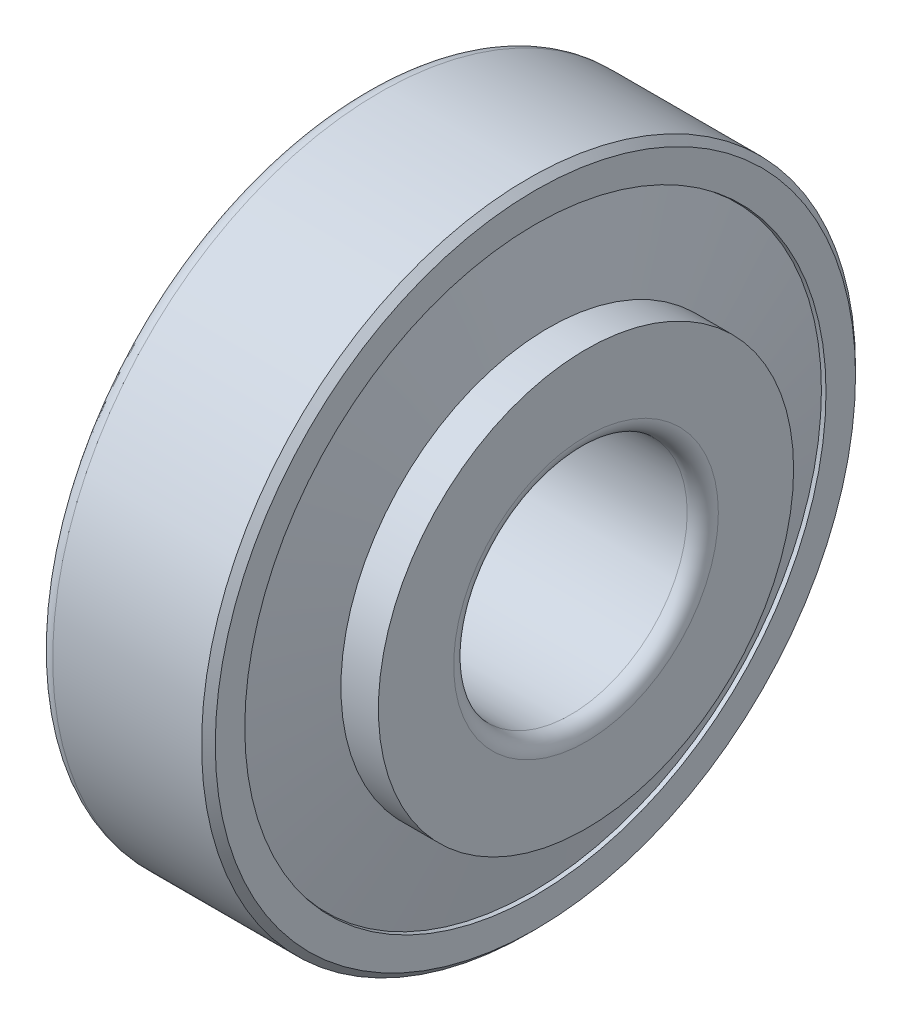
ISO-10303-21;
HEADER;
FILE_DESCRIPTION(('STEP AP214'),'2;1');
FILE_NAME('part.step','',(''),(''),'','','');
FILE_SCHEMA(('AUTOMOTIVE_DESIGN { 1 0 10303 214 1 1 1 1 }'));
ENDSEC;
DATA;
#1=APPLICATION_CONTEXT('core data for automotive mechanical design processes');
#2=APPLICATION_PROTOCOL_DEFINITION('international standard','automotive_design',2000,#1);
#3=PRODUCT_CONTEXT('',#1,'mechanical');
#4=PRODUCT('Part','Part','',(#3));
#5=PRODUCT_RELATED_PRODUCT_CATEGORY('part','',(#4));
#6=PRODUCT_DEFINITION_FORMATION('','',#4);
#7=PRODUCT_DEFINITION_CONTEXT('part definition',#1,'design');
#8=PRODUCT_DEFINITION('design','',#6,#7);
#9=PRODUCT_DEFINITION_SHAPE('','',#8);
#10=(LENGTH_UNIT() NAMED_UNIT(*) SI_UNIT(.MILLI.,.METRE.));
#11=(NAMED_UNIT(*) PLANE_ANGLE_UNIT() SI_UNIT($,.RADIAN.));
#12=(NAMED_UNIT(*) SI_UNIT($,.STERADIAN.) SOLID_ANGLE_UNIT());
#13=UNCERTAINTY_MEASURE_WITH_UNIT(LENGTH_MEASURE(1.E-05),#10,'distance_accuracy_value','');
#14=(GEOMETRIC_REPRESENTATION_CONTEXT(3) GLOBAL_UNCERTAINTY_ASSIGNED_CONTEXT((#13)) GLOBAL_UNIT_ASSIGNED_CONTEXT((#10,
#11,#12)) REPRESENTATION_CONTEXT('',''));
#15=CARTESIAN_POINT('',(0.,0.,0.));
#16=DIRECTION('',(0.,0.,1.));
#17=DIRECTION('',(1.,0.,0.));
#18=AXIS2_PLACEMENT_3D('',#15,#16,#17);
#19=CARTESIAN_POINT('',(-14.25,0.,0.));
#20=DIRECTION('',(1.,0.,0.));
#21=DIRECTION('',(0.,0.,-1.));
#22=AXIS2_PLACEMENT_3D('',#19,#20,#21);
#23=CONICAL_SURFACE('',#22,16.636,0.182386906833399);
#24=CARTESIAN_POINT('',(-13.2349987778327,0.,0.));
#25=DIRECTION('',(-1.,0.,0.));
#26=DIRECTION('',(0.,0.,1.));
#27=AXIS2_PLACEMENT_3D('',#24,#25,#26);
#28=CIRCLE('',#27,16.8232033231802);
#29=CARTESIAN_POINT('',(-13.2349987778327,0.,16.8232033231802));
#30=VERTEX_POINT('',#29);
#31=EDGE_CURVE('E43',#30,#30,#28,.T.);
#32=ORIENTED_EDGE('',*,*,#31,.F.);
#33=EDGE_LOOP('',(#32));
#34=FACE_BOUND('',#33,.T.);
#35=CARTESIAN_POINT('',(-14.25,0.,0.));
#36=DIRECTION('',(1.,0.,0.));
#37=DIRECTION('',(0.,0.,-1.));
#38=AXIS2_PLACEMENT_3D('',#35,#36,#37);
#39=CIRCLE('',#38,16.636);
#40=CARTESIAN_POINT('',(-14.25,0.,-16.636));
#41=VERTEX_POINT('',#40);
#42=EDGE_CURVE('E55',#41,#41,#39,.T.);
#43=ORIENTED_EDGE('',*,*,#42,.F.);
#44=EDGE_LOOP('',(#43));
#45=FACE_BOUND('',#44,.T.);
#46=ADVANCED_FACE('F32',(#34,#45),#23,.F.);
#47=CARTESIAN_POINT('',(-3.24999999999999,20.56,0.));
#48=DIRECTION('',(1.,0.,0.));
#49=DIRECTION('',(0.,0.,-1.));
#50=AXIS2_PLACEMENT_3D('',#47,#48,#49);
#51=PLANE('',#50);
#52=CARTESIAN_POINT('',(-3.25,0.,0.));
#53=DIRECTION('',(1.,0.,0.));
#54=DIRECTION('',(0.,0.,-1.));
#55=AXIS2_PLACEMENT_3D('',#52,#53,#54);
#56=CIRCLE('',#55,20.56);
#57=CARTESIAN_POINT('',(-3.25,0.,-20.56));
#58=VERTEX_POINT('',#57);
#59=EDGE_CURVE('E67',#58,#58,#56,.T.);
#60=ORIENTED_EDGE('',*,*,#59,.T.);
#61=EDGE_LOOP('',(#60));
#62=FACE_BOUND('',#61,.T.);
#63=CARTESIAN_POINT('',(-3.25,0.,0.));
#64=DIRECTION('',(1.,0.,0.));
#65=DIRECTION('',(0.,0.,-1.));
#66=AXIS2_PLACEMENT_3D('',#63,#64,#65);
#67=CIRCLE('',#66,18.6648020447751);
#68=CARTESIAN_POINT('',(-3.25,0.,-18.6648020447751));
#69=VERTEX_POINT('',#68);
#70=EDGE_CURVE('E52',#69,#69,#67,.T.);
#71=ORIENTED_EDGE('',*,*,#70,.F.);
#72=EDGE_LOOP('',(#71));
#73=FACE_BOUND('',#72,.T.);
#74=ADVANCED_FACE('F34',(#62,#73),#51,.T.);
#75=CARTESIAN_POINT('',(-3.49920449774943,0.,0.));
#76=DIRECTION('',(-1.,0.,0.));
#77=DIRECTION('',(0.,0.,1.));
#78=AXIS2_PLACEMENT_3D('',#75,#76,#77);
#79=CIRCLE('',#78,18.6188396270841);
#80=CARTESIAN_POINT('',(-3.49920449774943,0.,18.6188396270841));
#81=VERTEX_POINT('',#80);
#82=EDGE_CURVE('E47',#81,#81,#79,.F.);
#83=ORIENTED_EDGE('',*,*,#82,.F.);
#84=EDGE_LOOP('',(#83));
#85=FACE_BOUND('',#84,.T.);
#86=ORIENTED_EDGE('',*,*,#70,.T.);
#87=EDGE_LOOP('',(#86));
#88=FACE_BOUND('',#87,.T.);
#89=ADVANCED_FACE('F120',(#85,#88),#23,.F.);
#90=CARTESIAN_POINT('',(-14.25,16.636,0.));
#91=DIRECTION('',(-1.,0.,0.));
#92=DIRECTION('',(0.,0.,1.));
#93=AXIS2_PLACEMENT_3D('',#90,#91,#92);
#94=PLANE('',#93);
#95=ORIENTED_EDGE('',*,*,#42,.T.);
#96=EDGE_LOOP('',(#95));
#97=FACE_BOUND('',#96,.T.);
#98=CARTESIAN_POINT('',(-14.25,0.,0.));
#99=DIRECTION('',(1.,0.,0.));
#100=DIRECTION('',(0.,0.,-1.));
#101=AXIS2_PLACEMENT_3D('',#98,#99,#100);
#102=CIRCLE('',#101,20.);
#103=CARTESIAN_POINT('',(-14.25,0.,-20.));
#104=VERTEX_POINT('',#103);
#105=EDGE_CURVE('E58',#104,#104,#102,.T.);
#106=ORIENTED_EDGE('',*,*,#105,.F.);
#107=EDGE_LOOP('',(#106));
#108=FACE_BOUND('',#107,.T.);
#109=ADVANCED_FACE('F129',(#97,#108),#94,.T.);
#110=CARTESIAN_POINT('',(-13.25,0.,0.));
#111=DIRECTION('',(1.,0.,0.));
#112=DIRECTION('',(0.,0.,-1.));
#113=AXIS2_PLACEMENT_3D('',#110,#111,#112);
#114=TOROIDAL_SURFACE('',#113,20.,1.);
#115=ORIENTED_EDGE('',*,*,#105,.T.);
#116=EDGE_LOOP('',(#115));
#117=FACE_BOUND('',#116,.T.);
#118=CARTESIAN_POINT('',(-13.25,0.,0.));
#119=DIRECTION('',(1.,0.,0.));
#120=DIRECTION('',(0.,0.,-1.));
#121=AXIS2_PLACEMENT_3D('',#118,#119,#120);
#122=CIRCLE('',#121,21.);
#123=CARTESIAN_POINT('',(-13.25,0.,-21.));
#124=VERTEX_POINT('',#123);
#125=EDGE_CURVE('E61',#124,#124,#122,.T.);
#126=ORIENTED_EDGE('',*,*,#125,.F.);
#127=EDGE_LOOP('',(#126));
#128=FACE_BOUND('',#127,.T.);
#129=ADVANCED_FACE('F134',(#117,#128),#114,.T.);
#130=CARTESIAN_POINT('',(-42.5,0.,0.));
#131=DIRECTION('',(1.,0.,0.));
#132=DIRECTION('',(0.,0.,-1.));
#133=AXIS2_PLACEMENT_3D('',#130,#131,#132);
#134=CYLINDRICAL_SURFACE('',#133,21.);
#135=ORIENTED_EDGE('',*,*,#125,.T.);
#136=EDGE_LOOP('',(#135));
#137=FACE_BOUND('',#136,.T.);
#138=CARTESIAN_POINT('',(-3.69000000000001,0.,0.));
#139=DIRECTION('',(1.,0.,0.));
#140=DIRECTION('',(0.,0.,-1.));
#141=AXIS2_PLACEMENT_3D('',#138,#139,#140);
#142=CIRCLE('',#141,21.);
#143=CARTESIAN_POINT('',(-3.69000000000001,0.,-21.));
#144=VERTEX_POINT('',#143);
#145=EDGE_CURVE('E64',#144,#144,#142,.T.);
#146=ORIENTED_EDGE('',*,*,#145,.F.);
#147=EDGE_LOOP('',(#146));
#148=FACE_BOUND('',#147,.T.);
#149=ADVANCED_FACE('F156',(#137,#148),#134,.T.);
#150=CARTESIAN_POINT('',(-3.25,0.,0.));
#151=DIRECTION('',(-1.,0.,0.));
#152=DIRECTION('',(0.,0.,1.));
#153=AXIS2_PLACEMENT_3D('',#150,#151,#152);
#154=CONICAL_SURFACE('',#153,20.56,0.785398163397429);
#155=ORIENTED_EDGE('',*,*,#145,.T.);
#156=EDGE_LOOP('',(#155));
#157=FACE_BOUND('',#156,.T.);
#158=ORIENTED_EDGE('',*,*,#59,.F.);
#159=EDGE_LOOP('',(#158));
#160=FACE_BOUND('',#159,.T.);
#161=ADVANCED_FACE('F150',(#157,#160),#154,.T.);
#162=CARTESIAN_POINT('',(-13.25,0.,0.));
#163=DIRECTION('',(-1.,0.,0.));
#164=DIRECTION('',(0.,0.,1.));
#165=AXIS2_PLACEMENT_3D('',#162,#163,#164);
#166=CONICAL_SURFACE('',#165,16.9045387320561,1.38840941996149);
#167=CARTESIAN_POINT('',(-12.2041548699348,0.,0.));
#168=DIRECTION('',(-1.,0.,0.));
#169=DIRECTION('',(0.,0.,1.));
#170=AXIS2_PLACEMENT_3D('',#167,#168,#169);
#171=CIRCLE('',#170,11.2340513326844);
#172=CARTESIAN_POINT('',(-12.2041548699348,0.,11.2340513326844));
#173=VERTEX_POINT('',#172);
#174=EDGE_CURVE('E10',#173,#173,#171,.T.);
#175=ORIENTED_EDGE('',*,*,#174,.F.);
#176=EDGE_LOOP('',(#175));
#177=FACE_BOUND('',#176,.T.);
#178=ORIENTED_EDGE('',*,*,#31,.T.);
#179=EDGE_LOOP('',(#178));
#180=FACE_BOUND('',#179,.T.);
#181=ADVANCED_FACE('F144',(#177,#180),#166,.F.);
#182=CARTESIAN_POINT('',(-12.148132268059,0.,0.));
#183=DIRECTION('',(1.,0.,0.));
#184=DIRECTION('',(0.,0.,-1.));
#185=AXIS2_PLACEMENT_3D('',#182,#183,#184);
#186=CONICAL_SURFACE('',#185,10.9303013329141,0.182386906833401);
#187=CARTESIAN_POINT('',(-12.1428041755669,0.,0.));
#188=DIRECTION('',(-1.,0.,0.));
#189=DIRECTION('',(0.,0.,1.));
#190=AXIS2_PLACEMENT_3D('',#187,#188,#189);
#191=CIRCLE('',#190,10.9312840279089);
#192=CARTESIAN_POINT('',(-12.1428041755669,0.,10.9312840279089));
#193=VERTEX_POINT('',#192);
#194=EDGE_CURVE('E39',#193,#193,#191,.F.);
#195=ORIENTED_EDGE('',*,*,#194,.F.);
#196=EDGE_LOOP('',(#195));
#197=FACE_BOUND('',#196,.T.);
#198=CARTESIAN_POINT('',(-2.41233798797568,0.,0.));
#199=DIRECTION('',(1.,0.,0.));
#200=DIRECTION('',(0.,0.,-1.));
#201=AXIS2_PLACEMENT_3D('',#198,#199,#200);
#202=CIRCLE('',#201,12.725937636818);
#203=CARTESIAN_POINT('',(-2.41233798797568,0.,-12.725937636818));
#204=VERTEX_POINT('',#203);
#205=EDGE_CURVE('E70',#204,#204,#202,.T.);
#206=ORIENTED_EDGE('',*,*,#205,.T.);
#207=EDGE_LOOP('',(#206));
#208=FACE_BOUND('',#207,.T.);
#209=ADVANCED_FACE('F115',(#197,#208),#186,.F.);
#210=CARTESIAN_POINT('',(-2.41233798797568,0.,0.));
#211=DIRECTION('',(-1.,0.,0.));
#212=DIRECTION('',(0.,0.,1.));
#213=AXIS2_PLACEMENT_3D('',#210,#211,#212);
#214=CONICAL_SURFACE('',#213,12.725937636818,1.3884094199615);
#215=ORIENTED_EDGE('',*,*,#82,.T.);
#216=EDGE_LOOP('',(#215));
#217=FACE_BOUND('',#216,.T.);
#218=ORIENTED_EDGE('',*,*,#205,.F.);
#219=EDGE_LOOP('',(#218));
#220=FACE_BOUND('',#219,.T.);
#221=ADVANCED_FACE('F107',(#217,#220),#214,.T.);
#222=CARTESIAN_POINT('',(-12.1426229306505,0.,0.));
#223=DIRECTION('',(-1.,0.,0.));
#224=DIRECTION('',(0.,0.,1.));
#225=AXIS2_PLACEMENT_3D('',#222,#223,#224);
#226=CONICAL_SURFACE('',#225,10.9303013326844,1.38840941996148);
#227=ORIENTED_EDGE('',*,*,#194,.T.);
#228=EDGE_LOOP('',(#227));
#229=FACE_BOUND('',#228,.T.);
#230=CARTESIAN_POINT('',(-12.1426229306505,0.,0.));
#231=DIRECTION('',(1.,0.,0.));
#232=DIRECTION('',(0.,0.,-1.));
#233=AXIS2_PLACEMENT_3D('',#230,#231,#232);
#234=CIRCLE('',#233,10.9303013326844);
#235=CARTESIAN_POINT('',(-12.1426229306505,0.,-10.9303013326844));
#236=VERTEX_POINT('',#235);
#237=EDGE_CURVE('E97',#236,#236,#234,.T.);
#238=ORIENTED_EDGE('',*,*,#237,.F.);
#239=EDGE_LOOP('',(#238));
#240=FACE_BOUND('',#239,.T.);
#241=ADVANCED_FACE('F104',(#229,#240),#226,.T.);
#242=CARTESIAN_POINT('',(-42.5,0.,0.));
#243=DIRECTION('',(1.,0.,0.));
#244=DIRECTION('',(0.,0.,-1.));
#245=AXIS2_PLACEMENT_3D('',#242,#243,#244);
#246=CYLINDRICAL_SURFACE('',#245,11.2340513326844);
#247=ORIENTED_EDGE('',*,*,#174,.T.);
#248=EDGE_LOOP('',(#247));
#249=FACE_BOUND('',#248,.T.);
#250=CARTESIAN_POINT('',(-13.,0.,0.));
#251=DIRECTION('',(1.,0.,0.));
#252=DIRECTION('',(0.,0.,-1.));
#253=AXIS2_PLACEMENT_3D('',#250,#251,#252);
#254=CIRCLE('',#253,11.2340513326844);
#255=CARTESIAN_POINT('',(-13.,0.,-11.2340513326844));
#256=VERTEX_POINT('',#255);
#257=EDGE_CURVE('E73',#256,#256,#254,.T.);
#258=ORIENTED_EDGE('',*,*,#257,.T.);
#259=EDGE_LOOP('',(#258));
#260=FACE_BOUND('',#259,.T.);
#261=ADVANCED_FACE('F106',(#249,#260),#246,.T.);
#262=CARTESIAN_POINT('',(-13.,11.2340513326844,0.));
#263=DIRECTION('',(-1.,0.,0.));
#264=DIRECTION('',(0.,0.,1.));
#265=AXIS2_PLACEMENT_3D('',#262,#263,#264);
#266=PLANE('',#265);
#267=CARTESIAN_POINT('',(-13.,0.,0.));
#268=DIRECTION('',(1.,0.,0.));
#269=DIRECTION('',(0.,0.,-1.));
#270=AXIS2_PLACEMENT_3D('',#267,#268,#269);
#271=CIRCLE('',#270,7.94);
#272=CARTESIAN_POINT('',(-13.,0.,-7.94));
#273=VERTEX_POINT('',#272);
#274=EDGE_CURVE('E76',#273,#273,#271,.T.);
#275=ORIENTED_EDGE('',*,*,#274,.T.);
#276=EDGE_LOOP('',(#275));
#277=FACE_BOUND('',#276,.T.);
#278=ORIENTED_EDGE('',*,*,#257,.F.);
#279=EDGE_LOOP('',(#278));
#280=FACE_BOUND('',#279,.T.);
#281=ADVANCED_FACE('F113',(#277,#280),#266,.T.);
#282=CARTESIAN_POINT('',(-13.,0.,0.));
#283=DIRECTION('',(-1.,0.,0.));
#284=DIRECTION('',(0.,0.,1.));
#285=AXIS2_PLACEMENT_3D('',#282,#283,#284);
#286=CONICAL_SURFACE('',#285,7.94,0.785398163397452);
#287=CARTESIAN_POINT('',(-12.56,0.,0.));
#288=DIRECTION('',(1.,0.,0.));
#289=DIRECTION('',(0.,0.,-1.));
#290=AXIS2_PLACEMENT_3D('',#287,#288,#289);
#291=CIRCLE('',#290,7.5);
#292=CARTESIAN_POINT('',(-12.56,0.,-7.5));
#293=VERTEX_POINT('',#292);
#294=EDGE_CURVE('E79',#293,#293,#291,.T.);
#295=ORIENTED_EDGE('',*,*,#294,.T.);
#296=EDGE_LOOP('',(#295));
#297=FACE_BOUND('',#296,.T.);
#298=ORIENTED_EDGE('',*,*,#274,.F.);
#299=EDGE_LOOP('',(#298));
#300=FACE_BOUND('',#299,.T.);
#301=ADVANCED_FACE('F214',(#297,#300),#286,.F.);
#302=CARTESIAN_POINT('',(-42.5,0.,0.));
#303=DIRECTION('',(1.,0.,0.));
#304=DIRECTION('',(0.,0.,-1.));
#305=AXIS2_PLACEMENT_3D('',#302,#303,#304);
#306=CYLINDRICAL_SURFACE('',#305,7.5);
#307=CARTESIAN_POINT('',(-1.,0.,0.));
#308=DIRECTION('',(1.,0.,0.));
#309=DIRECTION('',(0.,0.,-1.));
#310=AXIS2_PLACEMENT_3D('',#307,#308,#309);
#311=CIRCLE('',#310,7.5);
#312=CARTESIAN_POINT('',(-1.,0.,-7.5));
#313=VERTEX_POINT('',#312);
#314=EDGE_CURVE('E82',#313,#313,#311,.T.);
#315=ORIENTED_EDGE('',*,*,#314,.T.);
#316=EDGE_LOOP('',(#315));
#317=FACE_BOUND('',#316,.T.);
#318=ORIENTED_EDGE('',*,*,#294,.F.);
#319=EDGE_LOOP('',(#318));
#320=FACE_BOUND('',#319,.T.);
#321=ADVANCED_FACE('F224',(#317,#320),#306,.F.);
#322=CARTESIAN_POINT('',(-1.,0.,0.));
#323=DIRECTION('',(1.,0.,0.));
#324=DIRECTION('',(0.,0.,-1.));
#325=AXIS2_PLACEMENT_3D('',#322,#323,#324);
#326=TOROIDAL_SURFACE('',#325,8.5,1.);
#327=CARTESIAN_POINT('',(0.,0.,0.));
#328=DIRECTION('',(1.,0.,0.));
#329=DIRECTION('',(0.,0.,-1.));
#330=AXIS2_PLACEMENT_3D('',#327,#328,#329);
#331=CIRCLE('',#330,8.5);
#332=CARTESIAN_POINT('',(0.,0.,-8.5));
#333=VERTEX_POINT('',#332);
#334=EDGE_CURVE('E85',#333,#333,#331,.T.);
#335=ORIENTED_EDGE('',*,*,#334,.T.);
#336=EDGE_LOOP('',(#335));
#337=FACE_BOUND('',#336,.T.);
#338=ORIENTED_EDGE('',*,*,#314,.F.);
#339=EDGE_LOOP('',(#338));
#340=FACE_BOUND('',#339,.T.);
#341=ADVANCED_FACE('F234',(#337,#340),#326,.T.);
#342=CARTESIAN_POINT('',(0.,8.5,0.));
#343=DIRECTION('',(1.,0.,0.));
#344=DIRECTION('',(0.,0.,-1.));
#345=AXIS2_PLACEMENT_3D('',#342,#343,#344);
#346=PLANE('',#345);
#347=CARTESIAN_POINT('',(0.,0.,0.));
#348=DIRECTION('',(1.,0.,0.));
#349=DIRECTION('',(0.,0.,-1.));
#350=AXIS2_PLACEMENT_3D('',#347,#348,#349);
#351=CIRCLE('',#350,13.3334376365884);
#352=CARTESIAN_POINT('',(0.,0.,-13.3334376365884));
#353=VERTEX_POINT('',#352);
#354=EDGE_CURVE('E88',#353,#353,#351,.T.);
#355=ORIENTED_EDGE('',*,*,#354,.T.);
#356=EDGE_LOOP('',(#355));
#357=FACE_BOUND('',#356,.T.);
#358=ORIENTED_EDGE('',*,*,#334,.F.);
#359=EDGE_LOOP('',(#358));
#360=FACE_BOUND('',#359,.T.);
#361=ADVANCED_FACE('F244',(#357,#360),#346,.T.);
#362=CARTESIAN_POINT('',(-42.5,0.,0.));
#363=DIRECTION('',(1.,0.,0.));
#364=DIRECTION('',(0.,0.,-1.));
#365=AXIS2_PLACEMENT_3D('',#362,#363,#364);
#366=CYLINDRICAL_SURFACE('',#365,13.3334376365884);
#367=CARTESIAN_POINT('',(-2.40682865056723,0.,0.));
#368=DIRECTION('',(1.,0.,0.));
#369=DIRECTION('',(0.,0.,-1.));
#370=AXIS2_PLACEMENT_3D('',#367,#368,#369);
#371=CIRCLE('',#370,13.3334376365884);
#372=CARTESIAN_POINT('',(-2.40682865056723,0.,-13.3334376365884));
#373=VERTEX_POINT('',#372);
#374=EDGE_CURVE('E91',#373,#373,#371,.T.);
#375=ORIENTED_EDGE('',*,*,#374,.T.);
#376=EDGE_LOOP('',(#375));
#377=FACE_BOUND('',#376,.T.);
#378=ORIENTED_EDGE('',*,*,#354,.F.);
#379=EDGE_LOOP('',(#378));
#380=FACE_BOUND('',#379,.T.);
#381=ADVANCED_FACE('F254',(#377,#380),#366,.T.);
#382=CARTESIAN_POINT('',(-2.40682865056723,13.3334376365884,0.));
#383=DIRECTION('',(-1.,0.,0.));
#384=DIRECTION('',(0.,0.,1.));
#385=AXIS2_PLACEMENT_3D('',#382,#383,#384);
#386=PLANE('',#385);
#387=CARTESIAN_POINT('',(-2.40682865056723,0.,0.));
#388=DIRECTION('',(1.,0.,0.));
#389=DIRECTION('',(0.,0.,-1.));
#390=AXIS2_PLACEMENT_3D('',#387,#388,#389);
#391=CIRCLE('',#390,12.7259376365884);
#392=CARTESIAN_POINT('',(-2.40682865056723,0.,-12.7259376365884));
#393=VERTEX_POINT('',#392);
#394=EDGE_CURVE('E94',#393,#393,#391,.T.);
#395=ORIENTED_EDGE('',*,*,#394,.T.);
#396=EDGE_LOOP('',(#395));
#397=FACE_BOUND('',#396,.T.);
#398=ORIENTED_EDGE('',*,*,#374,.F.);
#399=EDGE_LOOP('',(#398));
#400=FACE_BOUND('',#399,.T.);
#401=ADVANCED_FACE('F264',(#397,#400),#386,.T.);
#402=CARTESIAN_POINT('',(-2.40682865056723,0.,0.));
#403=DIRECTION('',(1.,0.,0.));
#404=DIRECTION('',(0.,0.,-1.));
#405=AXIS2_PLACEMENT_3D('',#402,#403,#404);
#406=CONICAL_SURFACE('',#405,12.7259376365884,0.182386906833401);
#407=ORIENTED_EDGE('',*,*,#237,.T.);
#408=EDGE_LOOP('',(#407));
#409=FACE_BOUND('',#408,.T.);
#410=ORIENTED_EDGE('',*,*,#394,.F.);
#411=EDGE_LOOP('',(#410));
#412=FACE_BOUND('',#411,.T.);
#413=ADVANCED_FACE('F101',(#409,#412),#406,.T.);
#414=CLOSED_SHELL('',(#46,#74,#89,#109,#129,#149,#161,#181,#209,#221,#241,#261,#281,#301,#321,
#341,#361,#381,#401,#413));
#415=MANIFOLD_SOLID_BREP('B2',#414);
#416=ADVANCED_BREP_SHAPE_REPRESENTATION('',(#18,#415),#14);
#417=SHAPE_DEFINITION_REPRESENTATION(#9,#416);
ENDSEC;
END-ISO-10303-21;
